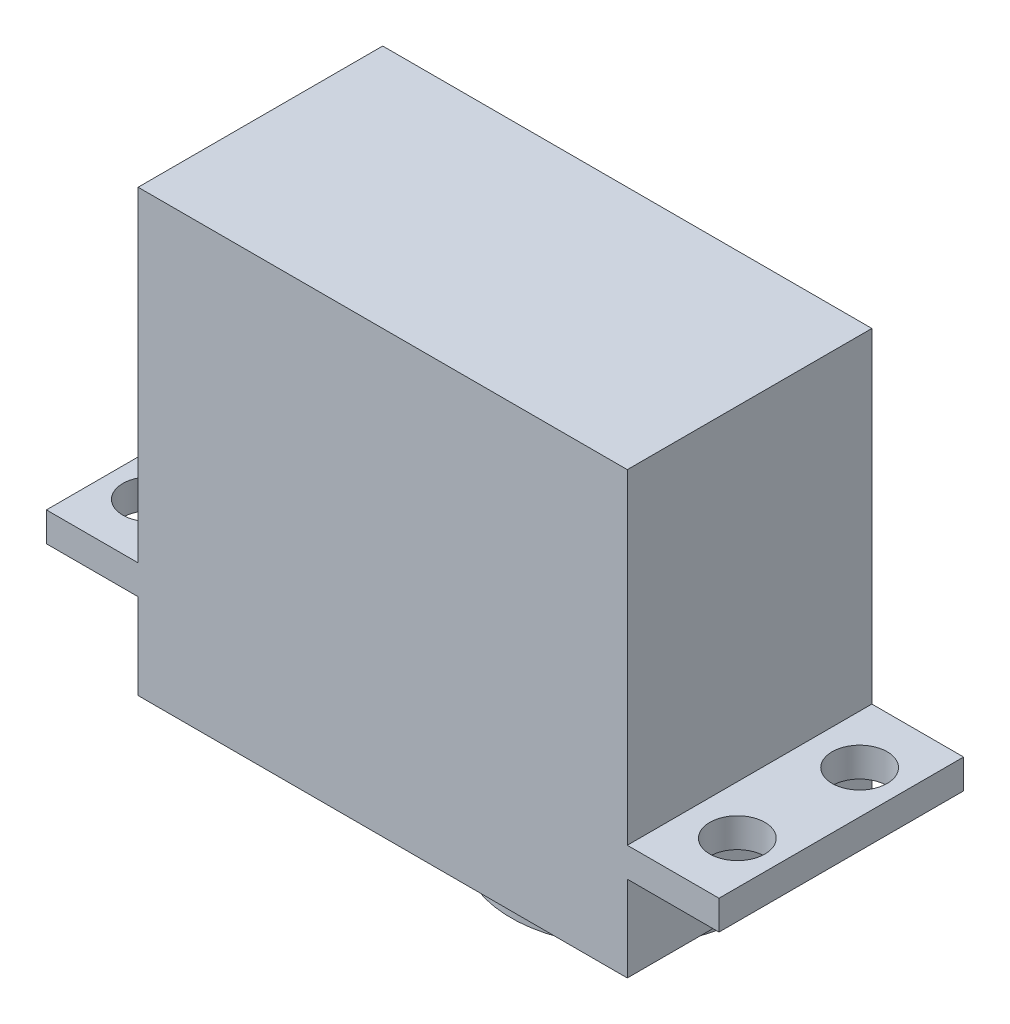
ISO-10303-21;
HEADER;
FILE_DESCRIPTION(('STEP AP214'),'2;1');
FILE_NAME('part.step','',(''),(''),'','','');
FILE_SCHEMA(('AUTOMOTIVE_DESIGN { 1 0 10303 214 1 1 1 1 }'));
ENDSEC;
DATA;
#1=APPLICATION_CONTEXT('core data for automotive mechanical design processes');
#2=APPLICATION_PROTOCOL_DEFINITION('international standard','automotive_design',2000,#1);
#3=PRODUCT_CONTEXT('',#1,'mechanical');
#4=PRODUCT('Part','Part','',(#3));
#5=PRODUCT_RELATED_PRODUCT_CATEGORY('part','',(#4));
#6=PRODUCT_DEFINITION_FORMATION('','',#4);
#7=PRODUCT_DEFINITION_CONTEXT('part definition',#1,'design');
#8=PRODUCT_DEFINITION('design','',#6,#7);
#9=PRODUCT_DEFINITION_SHAPE('','',#8);
#10=(LENGTH_UNIT() NAMED_UNIT(*) SI_UNIT(.MILLI.,.METRE.));
#11=(NAMED_UNIT(*) PLANE_ANGLE_UNIT() SI_UNIT($,.RADIAN.));
#12=(NAMED_UNIT(*) SI_UNIT($,.STERADIAN.) SOLID_ANGLE_UNIT());
#13=UNCERTAINTY_MEASURE_WITH_UNIT(LENGTH_MEASURE(1.E-05),#10,'distance_accuracy_value','');
#14=(GEOMETRIC_REPRESENTATION_CONTEXT(3) GLOBAL_UNCERTAINTY_ASSIGNED_CONTEXT((#13)) GLOBAL_UNIT_ASSIGNED_CONTEXT((#10,
#11,#12)) REPRESENTATION_CONTEXT('',''));
#15=CARTESIAN_POINT('',(0.,0.,0.));
#16=DIRECTION('',(0.,0.,1.));
#17=DIRECTION('',(1.,0.,0.));
#18=AXIS2_PLACEMENT_3D('',#15,#16,#17);
#19=CARTESIAN_POINT('',(0.,0.,0.));
#20=DIRECTION('',(0.,-1.,0.));
#21=DIRECTION('',(0.,0.,-1.));
#22=AXIS2_PLACEMENT_3D('',#19,#20,#21);
#23=PLANE('',#22);
#24=DIRECTION('',(0.,0.,-1.));
#25=VECTOR('',#24,1.);
#26=CARTESIAN_POINT('',(20.,0.,10.));
#27=LINE('',#26,#25);
#28=CARTESIAN_POINT('',(20.,0.,10.));
#29=VERTEX_POINT('',#28);
#30=CARTESIAN_POINT('',(20.,0.,-10.));
#31=VERTEX_POINT('',#30);
#32=EDGE_CURVE('E164',#29,#31,#27,.T.);
#33=ORIENTED_EDGE('',*,*,#32,.F.);
#34=DIRECTION('',(1.,0.,0.));
#35=VECTOR('',#34,1.);
#36=CARTESIAN_POINT('',(-20.,0.,10.));
#37=LINE('',#36,#35);
#38=CARTESIAN_POINT('',(-20.,0.,10.));
#39=VERTEX_POINT('',#38);
#40=EDGE_CURVE('E169',#39,#29,#37,.T.);
#41=ORIENTED_EDGE('',*,*,#40,.F.);
#42=DIRECTION('',(0.,0.,1.));
#43=VECTOR('',#42,1.);
#44=CARTESIAN_POINT('',(-20.,0.,10.));
#45=LINE('',#44,#43);
#46=CARTESIAN_POINT('',(-20.,0.,-10.));
#47=VERTEX_POINT('',#46);
#48=EDGE_CURVE('E181',#47,#39,#45,.T.);
#49=ORIENTED_EDGE('',*,*,#48,.F.);
#50=DIRECTION('',(-1.,0.,0.));
#51=VECTOR('',#50,1.);
#52=CARTESIAN_POINT('',(-20.,0.,-10.));
#53=LINE('',#52,#51);
#54=EDGE_CURVE('E178',#31,#47,#53,.T.);
#55=ORIENTED_EDGE('',*,*,#54,.F.);
#56=EDGE_LOOP('',(#33,#41,#49,#55));
#57=FACE_BOUND('',#56,.T.);
#58=CARTESIAN_POINT('',(10.,0.,0.));
#59=DIRECTION('',(0.,-1.,0.));
#60=DIRECTION('',(0.,0.,-1.));
#61=AXIS2_PLACEMENT_3D('',#58,#59,#60);
#62=CIRCLE('',#61,9.5);
#63=CARTESIAN_POINT('',(10.,0.,-9.5));
#64=VERTEX_POINT('',#63);
#65=EDGE_CURVE('E308',#64,#64,#62,.T.);
#66=ORIENTED_EDGE('',*,*,#65,.F.);
#67=EDGE_LOOP('',(#66));
#68=FACE_BOUND('',#67,.T.);
#69=ADVANCED_FACE('F35',(#57,#68),#23,.T.);
#70=CARTESIAN_POINT('',(20.,36.,10.));
#71=DIRECTION('',(-1.,0.,0.));
#72=DIRECTION('',(0.,0.,1.));
#73=AXIS2_PLACEMENT_3D('',#70,#71,#72);
#74=PLANE('',#73);
#75=DIRECTION('',(0.,0.,1.));
#76=VECTOR('',#75,1.);
#77=CARTESIAN_POINT('',(20.,9.4,10.));
#78=LINE('',#77,#76);
#79=CARTESIAN_POINT('',(20.,9.4,-10.));
#80=VERTEX_POINT('',#79);
#81=CARTESIAN_POINT('',(20.,9.4,10.));
#82=VERTEX_POINT('',#81);
#83=EDGE_CURVE('E162',#80,#82,#78,.T.);
#84=ORIENTED_EDGE('',*,*,#83,.F.);
#85=DIRECTION('',(0.,-1.,0.));
#86=VECTOR('',#85,1.);
#87=CARTESIAN_POINT('',(20.,36.,-10.));
#88=LINE('',#87,#86);
#89=CARTESIAN_POINT('',(20.,36.,-10.));
#90=VERTEX_POINT('',#89);
#91=EDGE_CURVE('E11',#90,#80,#88,.T.);
#92=ORIENTED_EDGE('',*,*,#91,.F.);
#93=DIRECTION('',(0.,0.,-1.));
#94=VECTOR('',#93,1.);
#95=CARTESIAN_POINT('',(20.,36.,10.));
#96=LINE('',#95,#94);
#97=CARTESIAN_POINT('',(20.,36.,10.));
#98=VERTEX_POINT('',#97);
#99=EDGE_CURVE('E165',#98,#90,#96,.T.);
#100=ORIENTED_EDGE('',*,*,#99,.F.);
#101=DIRECTION('',(0.,-1.,0.));
#102=VECTOR('',#101,1.);
#103=CARTESIAN_POINT('',(20.,36.,10.));
#104=LINE('',#103,#102);
#105=EDGE_CURVE('E186',#98,#82,#104,.T.);
#106=ORIENTED_EDGE('',*,*,#105,.T.);
#107=EDGE_LOOP('',(#84,#92,#100,#106));
#108=FACE_BOUND('',#107,.T.);
#109=ADVANCED_FACE('F254',(#108),#74,.F.);
#110=CARTESIAN_POINT('',(-20.,36.,10.));
#111=DIRECTION('',(1.,0.,0.));
#112=DIRECTION('',(0.,0.,-1.));
#113=AXIS2_PLACEMENT_3D('',#110,#111,#112);
#114=PLANE('',#113);
#115=DIRECTION('',(0.,0.,-1.));
#116=VECTOR('',#115,1.);
#117=CARTESIAN_POINT('',(-20.,9.4,10.));
#118=LINE('',#117,#116);
#119=CARTESIAN_POINT('',(-20.,9.4,10.));
#120=VERTEX_POINT('',#119);
#121=CARTESIAN_POINT('',(-20.,9.4,-10.));
#122=VERTEX_POINT('',#121);
#123=EDGE_CURVE('E160',#120,#122,#118,.T.);
#124=ORIENTED_EDGE('',*,*,#123,.F.);
#125=DIRECTION('',(0.,-1.,0.));
#126=VECTOR('',#125,1.);
#127=CARTESIAN_POINT('',(-20.,36.,10.));
#128=LINE('',#127,#126);
#129=CARTESIAN_POINT('',(-20.,36.,10.));
#130=VERTEX_POINT('',#129);
#131=EDGE_CURVE('E190',#130,#120,#128,.T.);
#132=ORIENTED_EDGE('',*,*,#131,.F.);
#133=DIRECTION('',(0.,0.,1.));
#134=VECTOR('',#133,1.);
#135=CARTESIAN_POINT('',(-20.,36.,10.));
#136=LINE('',#135,#134);
#137=CARTESIAN_POINT('',(-20.,36.,-10.));
#138=VERTEX_POINT('',#137);
#139=EDGE_CURVE('E171',#138,#130,#136,.T.);
#140=ORIENTED_EDGE('',*,*,#139,.F.);
#141=DIRECTION('',(0.,-1.,0.));
#142=VECTOR('',#141,1.);
#143=CARTESIAN_POINT('',(-20.,36.,-10.));
#144=LINE('',#143,#142);
#145=EDGE_CURVE('E193',#138,#122,#144,.T.);
#146=ORIENTED_EDGE('',*,*,#145,.T.);
#147=EDGE_LOOP('',(#124,#132,#140,#146));
#148=FACE_BOUND('',#147,.T.);
#149=ADVANCED_FACE('F259',(#148),#114,.F.);
#150=CARTESIAN_POINT('',(20.,7.,-10.));
#151=VERTEX_POINT('',#150);
#152=EDGE_CURVE('E43',#151,#31,#88,.T.);
#153=ORIENTED_EDGE('',*,*,#152,.F.);
#154=DIRECTION('',(0.,0.,1.));
#155=VECTOR('',#154,1.);
#156=CARTESIAN_POINT('',(20.,7.,10.));
#157=LINE('',#156,#155);
#158=CARTESIAN_POINT('',(20.,7.,10.));
#159=VERTEX_POINT('',#158);
#160=EDGE_CURVE('E152',#151,#159,#157,.T.);
#161=ORIENTED_EDGE('',*,*,#160,.T.);
#162=EDGE_CURVE('E175',#159,#29,#104,.T.);
#163=ORIENTED_EDGE('',*,*,#162,.T.);
#164=ORIENTED_EDGE('',*,*,#32,.T.);
#165=EDGE_LOOP('',(#153,#161,#163,#164));
#166=FACE_BOUND('',#165,.T.);
#167=ADVANCED_FACE('F37',(#166),#74,.F.);
#168=CARTESIAN_POINT('',(-20.,36.,-10.));
#169=DIRECTION('',(0.,0.,1.));
#170=DIRECTION('',(1.,0.,0.));
#171=AXIS2_PLACEMENT_3D('',#168,#169,#170);
#172=PLANE('',#171);
#173=CARTESIAN_POINT('',(-20.,7.,-10.));
#174=VERTEX_POINT('',#173);
#175=EDGE_CURVE('E192',#174,#47,#144,.T.);
#176=ORIENTED_EDGE('',*,*,#175,.F.);
#177=DIRECTION('',(-1.,0.,0.));
#178=VECTOR('',#177,1.);
#179=CARTESIAN_POINT('',(-27.5,7.,-10.));
#180=LINE('',#179,#178);
#181=CARTESIAN_POINT('',(-27.5,7.,-10.));
#182=VERTEX_POINT('',#181);
#183=EDGE_CURVE('E50',#174,#182,#180,.T.);
#184=ORIENTED_EDGE('',*,*,#183,.T.);
#185=DIRECTION('',(0.,-1.,0.));
#186=VECTOR('',#185,1.);
#187=CARTESIAN_POINT('',(-27.5,9.4,-10.));
#188=LINE('',#187,#186);
#189=CARTESIAN_POINT('',(-27.5,9.4,-10.));
#190=VERTEX_POINT('',#189);
#191=EDGE_CURVE('E150',#190,#182,#188,.T.);
#192=ORIENTED_EDGE('',*,*,#191,.F.);
#193=DIRECTION('',(-1.,0.,0.));
#194=VECTOR('',#193,1.);
#195=CARTESIAN_POINT('',(-27.5,9.4,-10.));
#196=LINE('',#195,#194);
#197=EDGE_CURVE('E135',#122,#190,#196,.T.);
#198=ORIENTED_EDGE('',*,*,#197,.F.);
#199=ORIENTED_EDGE('',*,*,#145,.F.);
#200=DIRECTION('',(-1.,0.,0.));
#201=VECTOR('',#200,1.);
#202=CARTESIAN_POINT('',(-20.,36.,-10.));
#203=LINE('',#202,#201);
#204=EDGE_CURVE('E168',#90,#138,#203,.T.);
#205=ORIENTED_EDGE('',*,*,#204,.F.);
#206=ORIENTED_EDGE('',*,*,#91,.T.);
#207=CARTESIAN_POINT('',(27.5,9.4,-10.));
#208=VERTEX_POINT('',#207);
#209=EDGE_CURVE('E123',#208,#80,#196,.T.);
#210=ORIENTED_EDGE('',*,*,#209,.F.);
#211=DIRECTION('',(0.,-1.,0.));
#212=VECTOR('',#211,1.);
#213=CARTESIAN_POINT('',(27.5,9.4,-10.));
#214=LINE('',#213,#212);
#215=CARTESIAN_POINT('',(27.5,7.,-10.));
#216=VERTEX_POINT('',#215);
#217=EDGE_CURVE('E129',#208,#216,#214,.T.);
#218=ORIENTED_EDGE('',*,*,#217,.T.);
#219=EDGE_CURVE('E229',#216,#151,#180,.T.);
#220=ORIENTED_EDGE('',*,*,#219,.T.);
#221=ORIENTED_EDGE('',*,*,#152,.T.);
#222=ORIENTED_EDGE('',*,*,#54,.T.);
#223=EDGE_LOOP('',(#176,#184,#192,#198,#199,#205,#206,#210,#218,#220,#221,#222));
#224=FACE_BOUND('',#223,.T.);
#225=ADVANCED_FACE('F126',(#224),#172,.F.);
#226=CARTESIAN_POINT('',(-20.,7.,10.));
#227=VERTEX_POINT('',#226);
#228=EDGE_CURVE('E189',#227,#39,#128,.T.);
#229=ORIENTED_EDGE('',*,*,#228,.F.);
#230=DIRECTION('',(0.,0.,-1.));
#231=VECTOR('',#230,1.);
#232=CARTESIAN_POINT('',(-20.,7.,10.));
#233=LINE('',#232,#231);
#234=EDGE_CURVE('E149',#227,#174,#233,.T.);
#235=ORIENTED_EDGE('',*,*,#234,.T.);
#236=ORIENTED_EDGE('',*,*,#175,.T.);
#237=ORIENTED_EDGE('',*,*,#48,.T.);
#238=EDGE_LOOP('',(#229,#235,#236,#237));
#239=FACE_BOUND('',#238,.T.);
#240=ADVANCED_FACE('F201',(#239),#114,.F.);
#241=CARTESIAN_POINT('',(-20.,36.,10.));
#242=DIRECTION('',(0.,0.,-1.));
#243=DIRECTION('',(-1.,0.,0.));
#244=AXIS2_PLACEMENT_3D('',#241,#242,#243);
#245=PLANE('',#244);
#246=ORIENTED_EDGE('',*,*,#162,.F.);
#247=DIRECTION('',(1.,0.,0.));
#248=VECTOR('',#247,1.);
#249=CARTESIAN_POINT('',(-27.5,7.,10.));
#250=LINE('',#249,#248);
#251=CARTESIAN_POINT('',(27.5,7.,10.));
#252=VERTEX_POINT('',#251);
#253=EDGE_CURVE('E58',#159,#252,#250,.T.);
#254=ORIENTED_EDGE('',*,*,#253,.T.);
#255=DIRECTION('',(0.,-1.,0.));
#256=VECTOR('',#255,1.);
#257=CARTESIAN_POINT('',(27.5,9.4,10.));
#258=LINE('',#257,#256);
#259=CARTESIAN_POINT('',(27.5,9.4,10.));
#260=VERTEX_POINT('',#259);
#261=EDGE_CURVE('E222',#260,#252,#258,.T.);
#262=ORIENTED_EDGE('',*,*,#261,.F.);
#263=DIRECTION('',(1.,0.,0.));
#264=VECTOR('',#263,1.);
#265=CARTESIAN_POINT('',(-27.5,9.4,10.));
#266=LINE('',#265,#264);
#267=EDGE_CURVE('E141',#82,#260,#266,.T.);
#268=ORIENTED_EDGE('',*,*,#267,.F.);
#269=ORIENTED_EDGE('',*,*,#105,.F.);
#270=DIRECTION('',(1.,0.,0.));
#271=VECTOR('',#270,1.);
#272=CARTESIAN_POINT('',(-20.,36.,10.));
#273=LINE('',#272,#271);
#274=EDGE_CURVE('E173',#130,#98,#273,.T.);
#275=ORIENTED_EDGE('',*,*,#274,.F.);
#276=ORIENTED_EDGE('',*,*,#131,.T.);
#277=CARTESIAN_POINT('',(-27.5,9.4,10.));
#278=VERTEX_POINT('',#277);
#279=EDGE_CURVE('E223',#278,#120,#266,.T.);
#280=ORIENTED_EDGE('',*,*,#279,.F.);
#281=DIRECTION('',(0.,-1.,0.));
#282=VECTOR('',#281,1.);
#283=CARTESIAN_POINT('',(-27.5,9.4,10.));
#284=LINE('',#283,#282);
#285=CARTESIAN_POINT('',(-27.5,7.,10.));
#286=VERTEX_POINT('',#285);
#287=EDGE_CURVE('E155',#278,#286,#284,.T.);
#288=ORIENTED_EDGE('',*,*,#287,.T.);
#289=EDGE_CURVE('E145',#286,#227,#250,.T.);
#290=ORIENTED_EDGE('',*,*,#289,.T.);
#291=ORIENTED_EDGE('',*,*,#228,.T.);
#292=ORIENTED_EDGE('',*,*,#40,.T.);
#293=EDGE_LOOP('',(#246,#254,#262,#268,#269,#275,#276,#280,#288,#290,#291,#292));
#294=FACE_BOUND('',#293,.T.);
#295=ADVANCED_FACE('F211',(#294),#245,.F.);
#296=CARTESIAN_POINT('',(0.,36.,0.));
#297=DIRECTION('',(0.,-1.,0.));
#298=DIRECTION('',(0.,0.,-1.));
#299=AXIS2_PLACEMENT_3D('',#296,#297,#298);
#300=PLANE('',#299);
#301=ORIENTED_EDGE('',*,*,#99,.T.);
#302=ORIENTED_EDGE('',*,*,#204,.T.);
#303=ORIENTED_EDGE('',*,*,#139,.T.);
#304=ORIENTED_EDGE('',*,*,#274,.T.);
#305=EDGE_LOOP('',(#301,#302,#303,#304));
#306=FACE_BOUND('',#305,.T.);
#307=ADVANCED_FACE('F263',(#306),#300,.F.);
#308=CARTESIAN_POINT('',(-27.5,9.4,10.));
#309=DIRECTION('',(1.,0.,0.));
#310=DIRECTION('',(0.,0.,-1.));
#311=AXIS2_PLACEMENT_3D('',#308,#309,#310);
#312=PLANE('',#311);
#313=DIRECTION('',(0.,0.,1.));
#314=VECTOR('',#313,1.);
#315=CARTESIAN_POINT('',(-27.5,7.,10.));
#316=LINE('',#315,#314);
#317=EDGE_CURVE('E218',#182,#286,#316,.T.);
#318=ORIENTED_EDGE('',*,*,#317,.T.);
#319=ORIENTED_EDGE('',*,*,#287,.F.);
#320=DIRECTION('',(0.,0.,1.));
#321=VECTOR('',#320,1.);
#322=CARTESIAN_POINT('',(-27.5,9.4,10.));
#323=LINE('',#322,#321);
#324=EDGE_CURVE('E134',#190,#278,#323,.T.);
#325=ORIENTED_EDGE('',*,*,#324,.F.);
#326=ORIENTED_EDGE('',*,*,#191,.T.);
#327=EDGE_LOOP('',(#318,#319,#325,#326));
#328=FACE_BOUND('',#327,.T.);
#329=ADVANCED_FACE('F234',(#328),#312,.F.);
#330=CARTESIAN_POINT('',(0.,9.4,0.));
#331=DIRECTION('',(0.,-1.,0.));
#332=DIRECTION('',(0.,0.,-1.));
#333=AXIS2_PLACEMENT_3D('',#330,#331,#332);
#334=PLANE('',#333);
#335=CARTESIAN_POINT('',(-24.,9.4,-5.));
#336=DIRECTION('',(0.,-1.,0.));
#337=DIRECTION('',(0.,0.,-1.));
#338=AXIS2_PLACEMENT_3D('',#335,#336,#337);
#339=CIRCLE('',#338,2.24999999999999);
#340=CARTESIAN_POINT('',(-24.,9.4,-7.24999999999999));
#341=VERTEX_POINT('',#340);
#342=EDGE_CURVE('E301',#341,#341,#339,.T.);
#343=ORIENTED_EDGE('',*,*,#342,.T.);
#344=EDGE_LOOP('',(#343));
#345=FACE_BOUND('',#344,.T.);
#346=CARTESIAN_POINT('',(-24.,9.4,5.));
#347=DIRECTION('',(0.,-1.,0.));
#348=DIRECTION('',(0.,0.,-1.));
#349=AXIS2_PLACEMENT_3D('',#346,#347,#348);
#350=CIRCLE('',#349,2.24999999999999);
#351=CARTESIAN_POINT('',(-24.,9.4,2.75000000000001));
#352=VERTEX_POINT('',#351);
#353=EDGE_CURVE('E295',#352,#352,#350,.T.);
#354=ORIENTED_EDGE('',*,*,#353,.T.);
#355=EDGE_LOOP('',(#354));
#356=FACE_BOUND('',#355,.T.);
#357=ORIENTED_EDGE('',*,*,#279,.T.);
#358=ORIENTED_EDGE('',*,*,#123,.T.);
#359=ORIENTED_EDGE('',*,*,#197,.T.);
#360=ORIENTED_EDGE('',*,*,#324,.T.);
#361=EDGE_LOOP('',(#357,#358,#359,#360));
#362=FACE_BOUND('',#361,.T.);
#363=ADVANCED_FACE('F237',(#345,#356,#362),#334,.F.);
#364=CARTESIAN_POINT('',(0.,7.,0.));
#365=DIRECTION('',(0.,-1.,0.));
#366=DIRECTION('',(0.,0.,-1.));
#367=AXIS2_PLACEMENT_3D('',#364,#365,#366);
#368=PLANE('',#367);
#369=CARTESIAN_POINT('',(-24.,6.99999999999999,-5.));
#370=DIRECTION('',(0.,-1.,0.));
#371=DIRECTION('',(0.,0.,-1.));
#372=AXIS2_PLACEMENT_3D('',#369,#370,#371);
#373=CIRCLE('',#372,2.24999999999999);
#374=CARTESIAN_POINT('',(-24.,6.99999999999999,-7.24999999999999));
#375=VERTEX_POINT('',#374);
#376=EDGE_CURVE('E304',#375,#375,#373,.T.);
#377=ORIENTED_EDGE('',*,*,#376,.F.);
#378=EDGE_LOOP('',(#377));
#379=FACE_BOUND('',#378,.T.);
#380=CARTESIAN_POINT('',(-24.,6.99999999999999,5.));
#381=DIRECTION('',(0.,-1.,0.));
#382=DIRECTION('',(0.,0.,-1.));
#383=AXIS2_PLACEMENT_3D('',#380,#381,#382);
#384=CIRCLE('',#383,2.24999999999999);
#385=CARTESIAN_POINT('',(-24.,6.99999999999999,2.75000000000001));
#386=VERTEX_POINT('',#385);
#387=EDGE_CURVE('E298',#386,#386,#384,.T.);
#388=ORIENTED_EDGE('',*,*,#387,.F.);
#389=EDGE_LOOP('',(#388));
#390=FACE_BOUND('',#389,.T.);
#391=ORIENTED_EDGE('',*,*,#234,.F.);
#392=ORIENTED_EDGE('',*,*,#289,.F.);
#393=ORIENTED_EDGE('',*,*,#317,.F.);
#394=ORIENTED_EDGE('',*,*,#183,.F.);
#395=EDGE_LOOP('',(#391,#392,#393,#394));
#396=FACE_BOUND('',#395,.T.);
#397=ADVANCED_FACE('F235',(#379,#390,#396),#368,.T.);
#398=CARTESIAN_POINT('',(24.,9.4,-5.));
#399=DIRECTION('',(0.,-1.,0.));
#400=DIRECTION('',(0.,0.,-1.));
#401=AXIS2_PLACEMENT_3D('',#398,#399,#400);
#402=CIRCLE('',#401,2.24999999999999);
#403=CARTESIAN_POINT('',(24.,9.4,-7.24999999999999));
#404=VERTEX_POINT('',#403);
#405=EDGE_CURVE('E289',#404,#404,#402,.T.);
#406=ORIENTED_EDGE('',*,*,#405,.T.);
#407=EDGE_LOOP('',(#406));
#408=FACE_BOUND('',#407,.T.);
#409=CARTESIAN_POINT('',(24.,9.4,5.));
#410=DIRECTION('',(0.,-1.,0.));
#411=DIRECTION('',(0.,0.,-1.));
#412=AXIS2_PLACEMENT_3D('',#409,#410,#411);
#413=CIRCLE('',#412,2.24999999999999);
#414=CARTESIAN_POINT('',(24.,9.4,2.75000000000001));
#415=VERTEX_POINT('',#414);
#416=EDGE_CURVE('E228',#415,#415,#413,.T.);
#417=ORIENTED_EDGE('',*,*,#416,.T.);
#418=EDGE_LOOP('',(#417));
#419=FACE_BOUND('',#418,.T.);
#420=ORIENTED_EDGE('',*,*,#209,.T.);
#421=ORIENTED_EDGE('',*,*,#83,.T.);
#422=ORIENTED_EDGE('',*,*,#267,.T.);
#423=DIRECTION('',(0.,0.,-1.));
#424=VECTOR('',#423,1.);
#425=CARTESIAN_POINT('',(27.5,9.4,10.));
#426=LINE('',#425,#424);
#427=EDGE_CURVE('E138',#260,#208,#426,.T.);
#428=ORIENTED_EDGE('',*,*,#427,.T.);
#429=EDGE_LOOP('',(#420,#421,#422,#428));
#430=FACE_BOUND('',#429,.T.);
#431=ADVANCED_FACE('F139',(#408,#419,#430),#334,.F.);
#432=CARTESIAN_POINT('',(24.,6.99999999999999,-5.));
#433=DIRECTION('',(0.,-1.,0.));
#434=DIRECTION('',(0.,0.,-1.));
#435=AXIS2_PLACEMENT_3D('',#432,#433,#434);
#436=CIRCLE('',#435,2.24999999999999);
#437=CARTESIAN_POINT('',(24.,6.99999999999999,-7.24999999999999));
#438=VERTEX_POINT('',#437);
#439=EDGE_CURVE('E292',#438,#438,#436,.T.);
#440=ORIENTED_EDGE('',*,*,#439,.F.);
#441=EDGE_LOOP('',(#440));
#442=FACE_BOUND('',#441,.T.);
#443=CARTESIAN_POINT('',(24.,6.99999999999999,5.));
#444=DIRECTION('',(0.,-1.,0.));
#445=DIRECTION('',(0.,0.,-1.));
#446=AXIS2_PLACEMENT_3D('',#443,#444,#445);
#447=CIRCLE('',#446,2.24999999999999);
#448=CARTESIAN_POINT('',(24.,6.99999999999999,2.75000000000001));
#449=VERTEX_POINT('',#448);
#450=EDGE_CURVE('E286',#449,#449,#447,.T.);
#451=ORIENTED_EDGE('',*,*,#450,.F.);
#452=EDGE_LOOP('',(#451));
#453=FACE_BOUND('',#452,.T.);
#454=ORIENTED_EDGE('',*,*,#160,.F.);
#455=ORIENTED_EDGE('',*,*,#219,.F.);
#456=DIRECTION('',(0.,0.,-1.));
#457=VECTOR('',#456,1.);
#458=CARTESIAN_POINT('',(27.5,7.,10.));
#459=LINE('',#458,#457);
#460=EDGE_CURVE('E148',#252,#216,#459,.T.);
#461=ORIENTED_EDGE('',*,*,#460,.F.);
#462=ORIENTED_EDGE('',*,*,#253,.F.);
#463=EDGE_LOOP('',(#454,#455,#461,#462));
#464=FACE_BOUND('',#463,.T.);
#465=ADVANCED_FACE('F240',(#442,#453,#464),#368,.T.);
#466=CARTESIAN_POINT('',(27.5,9.4,10.));
#467=DIRECTION('',(-1.,0.,0.));
#468=DIRECTION('',(0.,0.,1.));
#469=AXIS2_PLACEMENT_3D('',#466,#467,#468);
#470=PLANE('',#469);
#471=ORIENTED_EDGE('',*,*,#460,.T.);
#472=ORIENTED_EDGE('',*,*,#217,.F.);
#473=ORIENTED_EDGE('',*,*,#427,.F.);
#474=ORIENTED_EDGE('',*,*,#261,.T.);
#475=EDGE_LOOP('',(#471,#472,#473,#474));
#476=FACE_BOUND('',#475,.T.);
#477=ADVANCED_FACE('F147',(#476),#470,.F.);
#478=CARTESIAN_POINT('',(24.,7.,5.));
#479=DIRECTION('',(0.,-1.,0.));
#480=DIRECTION('',(0.,0.,-1.));
#481=AXIS2_PLACEMENT_3D('',#478,#479,#480);
#482=CYLINDRICAL_SURFACE('',#481,2.24999999999999);
#483=ORIENTED_EDGE('',*,*,#450,.T.);
#484=EDGE_LOOP('',(#483));
#485=FACE_BOUND('',#484,.T.);
#486=ORIENTED_EDGE('',*,*,#416,.F.);
#487=EDGE_LOOP('',(#486));
#488=FACE_BOUND('',#487,.T.);
#489=ADVANCED_FACE('F337',(#485,#488),#482,.F.);
#490=CARTESIAN_POINT('',(24.,7.,-5.));
#491=DIRECTION('',(0.,-1.,0.));
#492=DIRECTION('',(0.,0.,-1.));
#493=AXIS2_PLACEMENT_3D('',#490,#491,#492);
#494=CYLINDRICAL_SURFACE('',#493,2.24999999999999);
#495=ORIENTED_EDGE('',*,*,#439,.T.);
#496=EDGE_LOOP('',(#495));
#497=FACE_BOUND('',#496,.T.);
#498=ORIENTED_EDGE('',*,*,#405,.F.);
#499=EDGE_LOOP('',(#498));
#500=FACE_BOUND('',#499,.T.);
#501=ADVANCED_FACE('F333',(#497,#500),#494,.F.);
#502=CARTESIAN_POINT('',(-24.,7.,5.));
#503=DIRECTION('',(0.,-1.,0.));
#504=DIRECTION('',(0.,0.,-1.));
#505=AXIS2_PLACEMENT_3D('',#502,#503,#504);
#506=CYLINDRICAL_SURFACE('',#505,2.24999999999999);
#507=ORIENTED_EDGE('',*,*,#387,.T.);
#508=EDGE_LOOP('',(#507));
#509=FACE_BOUND('',#508,.T.);
#510=ORIENTED_EDGE('',*,*,#353,.F.);
#511=EDGE_LOOP('',(#510));
#512=FACE_BOUND('',#511,.T.);
#513=ADVANCED_FACE('F327',(#509,#512),#506,.F.);
#514=CARTESIAN_POINT('',(-24.,7.,-5.));
#515=DIRECTION('',(0.,-1.,0.));
#516=DIRECTION('',(0.,0.,-1.));
#517=AXIS2_PLACEMENT_3D('',#514,#515,#516);
#518=CYLINDRICAL_SURFACE('',#517,2.24999999999999);
#519=ORIENTED_EDGE('',*,*,#376,.T.);
#520=EDGE_LOOP('',(#519));
#521=FACE_BOUND('',#520,.T.);
#522=ORIENTED_EDGE('',*,*,#342,.F.);
#523=EDGE_LOOP('',(#522));
#524=FACE_BOUND('',#523,.T.);
#525=ADVANCED_FACE('F319',(#521,#524),#518,.F.);
#526=CARTESIAN_POINT('',(10.,-1.,0.));
#527=DIRECTION('',(0.,1.,0.));
#528=DIRECTION('',(0.,0.,1.));
#529=AXIS2_PLACEMENT_3D('',#526,#527,#528);
#530=CYLINDRICAL_SURFACE('',#529,9.5);
#531=CARTESIAN_POINT('',(10.,-1.,0.));
#532=DIRECTION('',(0.,-1.,0.));
#533=DIRECTION('',(0.,0.,-1.));
#534=AXIS2_PLACEMENT_3D('',#531,#532,#533);
#535=CIRCLE('',#534,9.5);
#536=CARTESIAN_POINT('',(10.,-1.,-9.5));
#537=VERTEX_POINT('',#536);
#538=EDGE_CURVE('E307',#537,#537,#535,.T.);
#539=ORIENTED_EDGE('',*,*,#538,.F.);
#540=EDGE_LOOP('',(#539));
#541=FACE_BOUND('',#540,.T.);
#542=ORIENTED_EDGE('',*,*,#65,.T.);
#543=EDGE_LOOP('',(#542));
#544=FACE_BOUND('',#543,.T.);
#545=ADVANCED_FACE('F316',(#541,#544),#530,.T.);
#546=CARTESIAN_POINT('',(10.,-1.,0.));
#547=DIRECTION('',(0.,-1.,0.));
#548=DIRECTION('',(0.,0.,-1.));
#549=AXIS2_PLACEMENT_3D('',#546,#547,#548);
#550=PLANE('',#549);
#551=ORIENTED_EDGE('',*,*,#538,.T.);
#552=EDGE_LOOP('',(#551));
#553=FACE_BOUND('',#552,.T.);
#554=ADVANCED_FACE('F314',(#553),#550,.T.);
#555=CLOSED_SHELL('',(#69,#109,#149,#167,#225,#240,#295,#307,#329,#363,#397,#431,#465,#477,#489,
#501,#513,#525,#545,#554));
#556=MANIFOLD_SOLID_BREP('B2',#555);
#557=ADVANCED_BREP_SHAPE_REPRESENTATION('',(#18,#556),#14);
#558=SHAPE_DEFINITION_REPRESENTATION(#9,#557);
ENDSEC;
END-ISO-10303-21;
